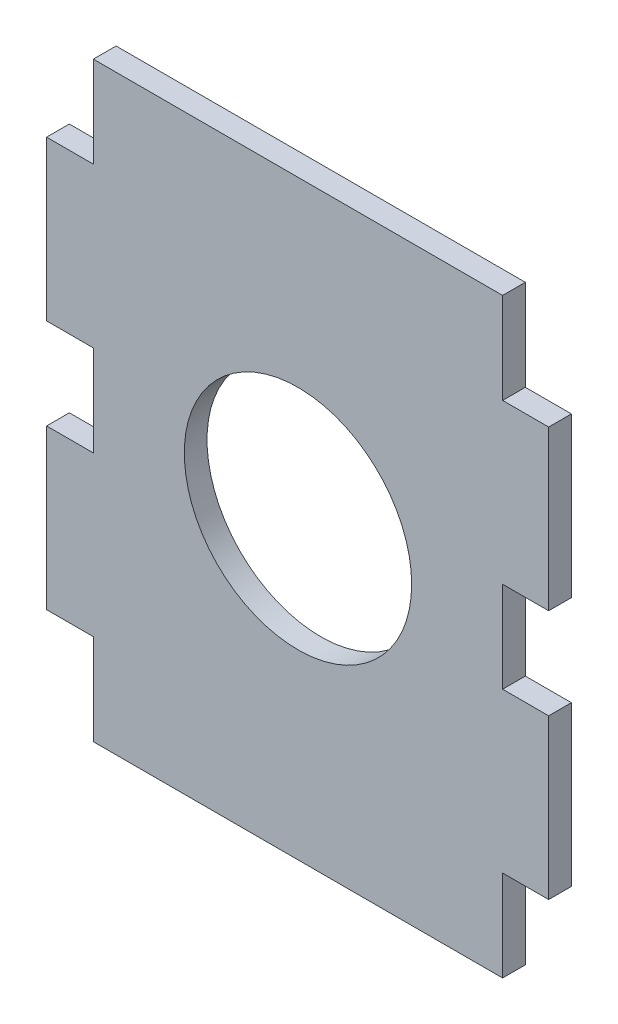
ISO-10303-21;
HEADER;
FILE_DESCRIPTION(('STEP AP214'),'2;1');
FILE_NAME('part.step','',(''),(''),'','','');
FILE_SCHEMA(('AUTOMOTIVE_DESIGN { 1 0 10303 214 1 1 1 1 }'));
ENDSEC;
DATA;
#1=APPLICATION_CONTEXT('core data for automotive mechanical design processes');
#2=APPLICATION_PROTOCOL_DEFINITION('international standard','automotive_design',2000,#1);
#3=PRODUCT_CONTEXT('',#1,'mechanical');
#4=PRODUCT('Part','Part','',(#3));
#5=PRODUCT_RELATED_PRODUCT_CATEGORY('part','',(#4));
#6=PRODUCT_DEFINITION_FORMATION('','',#4);
#7=PRODUCT_DEFINITION_CONTEXT('part definition',#1,'design');
#8=PRODUCT_DEFINITION('design','',#6,#7);
#9=PRODUCT_DEFINITION_SHAPE('','',#8);
#10=(LENGTH_UNIT() NAMED_UNIT(*) SI_UNIT(.MILLI.,.METRE.));
#11=(NAMED_UNIT(*) PLANE_ANGLE_UNIT() SI_UNIT($,.RADIAN.));
#12=(NAMED_UNIT(*) SI_UNIT($,.STERADIAN.) SOLID_ANGLE_UNIT());
#13=UNCERTAINTY_MEASURE_WITH_UNIT(LENGTH_MEASURE(1.E-05),#10,'distance_accuracy_value','');
#14=(GEOMETRIC_REPRESENTATION_CONTEXT(3) GLOBAL_UNCERTAINTY_ASSIGNED_CONTEXT((#13)) GLOBAL_UNIT_ASSIGNED_CONTEXT((#10,
#11,#12)) REPRESENTATION_CONTEXT('',''));
#15=CARTESIAN_POINT('',(0.,0.,0.));
#16=DIRECTION('',(0.,0.,1.));
#17=DIRECTION('',(1.,0.,0.));
#18=AXIS2_PLACEMENT_3D('',#15,#16,#17);
#19=CARTESIAN_POINT('',(-56.6737694950337,356.078918743844,-3.175));
#20=DIRECTION('',(-1.,0.,0.));
#21=DIRECTION('',(0.,0.,1.));
#22=AXIS2_PLACEMENT_3D('',#19,#20,#21);
#23=PLANE('',#22);
#24=DIRECTION('',(0.,-1.,0.));
#25=VECTOR('',#24,1.);
#26=CARTESIAN_POINT('',(-56.6737694950337,356.078918743844,0.));
#27=LINE('',#26,#25);
#28=CARTESIAN_POINT('',(-56.6737694950337,356.078918743844,0.));
#29=VERTEX_POINT('',#28);
#30=CARTESIAN_POINT('',(-56.6737694950337,343.378918743844,0.));
#31=VERTEX_POINT('',#30);
#32=EDGE_CURVE('E202',#29,#31,#27,.T.);
#33=ORIENTED_EDGE('',*,*,#32,.F.);
#34=DIRECTION('',(0.,0.,1.));
#35=VECTOR('',#34,1.);
#36=CARTESIAN_POINT('',(-56.6737694950337,356.078918743844,-3.175));
#37=LINE('',#36,#35);
#38=CARTESIAN_POINT('',(-56.6737694950337,356.078918743844,-3.175));
#39=VERTEX_POINT('',#38);
#40=EDGE_CURVE('E11',#39,#29,#37,.T.);
#41=ORIENTED_EDGE('',*,*,#40,.F.);
#42=DIRECTION('',(0.,-1.,0.));
#43=VECTOR('',#42,1.);
#44=CARTESIAN_POINT('',(-56.6737694950337,356.078918743844,-3.175));
#45=LINE('',#44,#43);
#46=CARTESIAN_POINT('',(-56.6737694950337,343.378918743844,-3.175));
#47=VERTEX_POINT('',#46);
#48=EDGE_CURVE('E259',#39,#47,#45,.T.);
#49=ORIENTED_EDGE('',*,*,#48,.T.);
#50=DIRECTION('',(0.,0.,1.));
#51=VECTOR('',#50,1.);
#52=CARTESIAN_POINT('',(-56.6737694950337,343.378918743844,-3.175));
#53=LINE('',#52,#51);
#54=EDGE_CURVE('E36',#47,#31,#53,.T.);
#55=ORIENTED_EDGE('',*,*,#54,.T.);
#56=EDGE_LOOP('',(#33,#41,#49,#55));
#57=FACE_BOUND('',#56,.T.);
#58=ADVANCED_FACE('F33',(#57),#23,.T.);
#59=CARTESIAN_POINT('',(-56.6737694950337,356.078918743844,-3.175));
#60=DIRECTION('',(0.,1.,0.));
#61=DIRECTION('',(0.,0.,1.));
#62=AXIS2_PLACEMENT_3D('',#59,#60,#61);
#63=PLANE('',#62);
#64=DIRECTION('',(-1.,0.,0.));
#65=VECTOR('',#64,1.);
#66=CARTESIAN_POINT('',(-56.6737694950337,356.078918743844,0.));
#67=LINE('',#66,#65);
#68=CARTESIAN_POINT('',(0.476230502818833,356.078918743844,0.));
#69=VERTEX_POINT('',#68);
#70=EDGE_CURVE('E257',#69,#29,#67,.T.);
#71=ORIENTED_EDGE('',*,*,#70,.F.);
#72=DIRECTION('',(0.,0.,1.));
#73=VECTOR('',#72,1.);
#74=CARTESIAN_POINT('',(0.476230502818833,356.078918743844,-3.175));
#75=LINE('',#74,#73);
#76=CARTESIAN_POINT('',(0.476230502818833,356.078918743844,-3.175));
#77=VERTEX_POINT('',#76);
#78=EDGE_CURVE('E42',#77,#69,#75,.T.);
#79=ORIENTED_EDGE('',*,*,#78,.F.);
#80=DIRECTION('',(-1.,0.,0.));
#81=VECTOR('',#80,1.);
#82=CARTESIAN_POINT('',(-56.6737694950337,356.078918743844,-3.175));
#83=LINE('',#82,#81);
#84=EDGE_CURVE('E192',#77,#39,#83,.T.);
#85=ORIENTED_EDGE('',*,*,#84,.T.);
#86=ORIENTED_EDGE('',*,*,#40,.T.);
#87=EDGE_LOOP('',(#71,#79,#85,#86));
#88=FACE_BOUND('',#87,.T.);
#89=ADVANCED_FACE('F295',(#88),#63,.T.);
#90=CARTESIAN_POINT('',(0.476230502818833,356.078918743844,-3.175));
#91=DIRECTION('',(1.,0.,0.));
#92=DIRECTION('',(0.,0.,-1.));
#93=AXIS2_PLACEMENT_3D('',#90,#91,#92);
#94=PLANE('',#93);
#95=DIRECTION('',(0.,1.,0.));
#96=VECTOR('',#95,1.);
#97=CARTESIAN_POINT('',(0.476230502818833,356.078918743844,0.));
#98=LINE('',#97,#96);
#99=CARTESIAN_POINT('',(0.476230502818833,343.378918743844,0.));
#100=VERTEX_POINT('',#99);
#101=EDGE_CURVE('E179',#100,#69,#98,.T.);
#102=ORIENTED_EDGE('',*,*,#101,.F.);
#103=DIRECTION('',(0.,0.,1.));
#104=VECTOR('',#103,1.);
#105=CARTESIAN_POINT('',(0.476230502818833,343.378918743844,-3.175));
#106=LINE('',#105,#104);
#107=CARTESIAN_POINT('',(0.476230502818833,343.378918743844,-3.175));
#108=VERTEX_POINT('',#107);
#109=EDGE_CURVE('E174',#108,#100,#106,.T.);
#110=ORIENTED_EDGE('',*,*,#109,.F.);
#111=DIRECTION('',(0.,1.,0.));
#112=VECTOR('',#111,1.);
#113=CARTESIAN_POINT('',(0.476230502818833,356.078918743844,-3.175));
#114=LINE('',#113,#112);
#115=EDGE_CURVE('E177',#108,#77,#114,.T.);
#116=ORIENTED_EDGE('',*,*,#115,.T.);
#117=ORIENTED_EDGE('',*,*,#78,.T.);
#118=EDGE_LOOP('',(#102,#110,#116,#117));
#119=FACE_BOUND('',#118,.T.);
#120=ADVANCED_FACE('F176',(#119),#94,.T.);
#121=CARTESIAN_POINT('',(6.90850310501321,343.378918743844,-3.175));
#122=DIRECTION('',(0.,1.,0.));
#123=DIRECTION('',(0.,0.,1.));
#124=AXIS2_PLACEMENT_3D('',#121,#122,#123);
#125=PLANE('',#124);
#126=DIRECTION('',(-1.,0.,0.));
#127=VECTOR('',#126,1.);
#128=CARTESIAN_POINT('',(6.90850310501321,343.378918743844,0.));
#129=LINE('',#128,#127);
#130=CARTESIAN_POINT('',(6.90850310501321,343.378918743844,0.));
#131=VERTEX_POINT('',#130);
#132=EDGE_CURVE('E254',#131,#100,#129,.T.);
#133=ORIENTED_EDGE('',*,*,#132,.F.);
#134=DIRECTION('',(0.,0.,1.));
#135=VECTOR('',#134,1.);
#136=CARTESIAN_POINT('',(6.90850310501321,343.378918743844,-3.175));
#137=LINE('',#136,#135);
#138=CARTESIAN_POINT('',(6.90850310501321,343.378918743844,-3.175));
#139=VERTEX_POINT('',#138);
#140=EDGE_CURVE('E184',#139,#131,#137,.T.);
#141=ORIENTED_EDGE('',*,*,#140,.F.);
#142=DIRECTION('',(-1.,0.,0.));
#143=VECTOR('',#142,1.);
#144=CARTESIAN_POINT('',(6.90850310501321,343.378918743844,-3.175));
#145=LINE('',#144,#143);
#146=EDGE_CURVE('E190',#139,#108,#145,.T.);
#147=ORIENTED_EDGE('',*,*,#146,.T.);
#148=ORIENTED_EDGE('',*,*,#109,.T.);
#149=EDGE_LOOP('',(#133,#141,#147,#148));
#150=FACE_BOUND('',#149,.T.);
#151=ADVANCED_FACE('F194',(#150),#125,.T.);
#152=CARTESIAN_POINT('',(6.90850310501321,343.378918743844,-3.175));
#153=DIRECTION('',(1.,0.,0.));
#154=DIRECTION('',(0.,1.,0.));
#155=AXIS2_PLACEMENT_3D('',#152,#153,#154);
#156=PLANE('',#155);
#157=DIRECTION('',(0.,1.,0.));
#158=VECTOR('',#157,1.);
#159=CARTESIAN_POINT('',(6.90850310501321,343.378918743844,0.));
#160=LINE('',#159,#158);
#161=CARTESIAN_POINT('',(6.90850310501322,321.153918743844,0.));
#162=VERTEX_POINT('',#161);
#163=EDGE_CURVE('E251',#162,#131,#160,.T.);
#164=ORIENTED_EDGE('',*,*,#163,.F.);
#165=DIRECTION('',(0.,0.,1.));
#166=VECTOR('',#165,1.);
#167=CARTESIAN_POINT('',(6.90850310501322,321.153918743844,-3.175));
#168=LINE('',#167,#166);
#169=CARTESIAN_POINT('',(6.90850310501322,321.153918743844,-3.175));
#170=VERTEX_POINT('',#169);
#171=EDGE_CURVE('E263',#170,#162,#168,.T.);
#172=ORIENTED_EDGE('',*,*,#171,.F.);
#173=DIRECTION('',(0.,1.,0.));
#174=VECTOR('',#173,1.);
#175=CARTESIAN_POINT('',(6.90850310501321,343.378918743844,-3.175));
#176=LINE('',#175,#174);
#177=EDGE_CURVE('E195',#170,#139,#176,.T.);
#178=ORIENTED_EDGE('',*,*,#177,.T.);
#179=ORIENTED_EDGE('',*,*,#140,.T.);
#180=EDGE_LOOP('',(#164,#172,#178,#179));
#181=FACE_BOUND('',#180,.T.);
#182=ADVANCED_FACE('F308',(#181),#156,.T.);
#183=CARTESIAN_POINT('',(6.90850310501322,321.153918743844,-3.175));
#184=DIRECTION('',(0.,-1.,0.));
#185=DIRECTION('',(0.,0.,-1.));
#186=AXIS2_PLACEMENT_3D('',#183,#184,#185);
#187=PLANE('',#186);
#188=DIRECTION('',(1.,0.,0.));
#189=VECTOR('',#188,1.);
#190=CARTESIAN_POINT('',(6.90850310501322,321.153918743844,0.));
#191=LINE('',#190,#189);
#192=CARTESIAN_POINT('',(0.476230502818833,321.153918743844,0.));
#193=VERTEX_POINT('',#192);
#194=EDGE_CURVE('E248',#193,#162,#191,.T.);
#195=ORIENTED_EDGE('',*,*,#194,.F.);
#196=DIRECTION('',(0.,0.,1.));
#197=VECTOR('',#196,1.);
#198=CARTESIAN_POINT('',(0.476230502818833,321.153918743844,-3.175));
#199=LINE('',#198,#197);
#200=CARTESIAN_POINT('',(0.476230502818833,321.153918743844,-3.175));
#201=VERTEX_POINT('',#200);
#202=EDGE_CURVE('E265',#201,#193,#199,.T.);
#203=ORIENTED_EDGE('',*,*,#202,.F.);
#204=DIRECTION('',(1.,0.,0.));
#205=VECTOR('',#204,1.);
#206=CARTESIAN_POINT('',(6.90850310501322,321.153918743844,-3.175));
#207=LINE('',#206,#205);
#208=EDGE_CURVE('E197',#201,#170,#207,.T.);
#209=ORIENTED_EDGE('',*,*,#208,.T.);
#210=ORIENTED_EDGE('',*,*,#171,.T.);
#211=EDGE_LOOP('',(#195,#203,#209,#210));
#212=FACE_BOUND('',#211,.T.);
#213=ADVANCED_FACE('F311',(#212),#187,.T.);
#214=CARTESIAN_POINT('',(0.476230502818833,308.453918743844,-3.175));
#215=DIRECTION('',(1.,0.,0.));
#216=DIRECTION('',(0.,0.,-1.));
#217=AXIS2_PLACEMENT_3D('',#214,#215,#216);
#218=PLANE('',#217);
#219=DIRECTION('',(0.,1.,0.));
#220=VECTOR('',#219,1.);
#221=CARTESIAN_POINT('',(0.476230502818833,308.453918743844,0.));
#222=LINE('',#221,#220);
#223=CARTESIAN_POINT('',(0.476230502818833,308.453918743844,0.));
#224=VERTEX_POINT('',#223);
#225=EDGE_CURVE('E245',#224,#193,#222,.T.);
#226=ORIENTED_EDGE('',*,*,#225,.F.);
#227=DIRECTION('',(0.,0.,1.));
#228=VECTOR('',#227,1.);
#229=CARTESIAN_POINT('',(0.476230502818833,308.453918743844,-3.175));
#230=LINE('',#229,#228);
#231=CARTESIAN_POINT('',(0.476230502818833,308.453918743844,-3.175));
#232=VERTEX_POINT('',#231);
#233=EDGE_CURVE('E267',#232,#224,#230,.T.);
#234=ORIENTED_EDGE('',*,*,#233,.F.);
#235=DIRECTION('',(0.,1.,0.));
#236=VECTOR('',#235,1.);
#237=CARTESIAN_POINT('',(0.476230502818833,308.453918743844,-3.175));
#238=LINE('',#237,#236);
#239=EDGE_CURVE('E430',#232,#201,#238,.T.);
#240=ORIENTED_EDGE('',*,*,#239,.T.);
#241=ORIENTED_EDGE('',*,*,#202,.T.);
#242=EDGE_LOOP('',(#226,#234,#240,#241));
#243=FACE_BOUND('',#242,.T.);
#244=ADVANCED_FACE('F315',(#243),#218,.T.);
#245=CARTESIAN_POINT('',(6.90850310501322,308.453918743844,-3.175));
#246=DIRECTION('',(0.,1.,0.));
#247=DIRECTION('',(0.,0.,1.));
#248=AXIS2_PLACEMENT_3D('',#245,#246,#247);
#249=PLANE('',#248);
#250=DIRECTION('',(-1.,0.,0.));
#251=VECTOR('',#250,1.);
#252=CARTESIAN_POINT('',(6.90850310501322,308.453918743844,0.));
#253=LINE('',#252,#251);
#254=CARTESIAN_POINT('',(6.90850310501322,308.453918743844,0.));
#255=VERTEX_POINT('',#254);
#256=EDGE_CURVE('E242',#255,#224,#253,.T.);
#257=ORIENTED_EDGE('',*,*,#256,.F.);
#258=DIRECTION('',(0.,0.,1.));
#259=VECTOR('',#258,1.);
#260=CARTESIAN_POINT('',(6.90850310501322,308.453918743844,-3.175));
#261=LINE('',#260,#259);
#262=CARTESIAN_POINT('',(6.90850310501322,308.453918743844,-3.175));
#263=VERTEX_POINT('',#262);
#264=EDGE_CURVE('E269',#263,#255,#261,.T.);
#265=ORIENTED_EDGE('',*,*,#264,.F.);
#266=DIRECTION('',(-1.,0.,0.));
#267=VECTOR('',#266,1.);
#268=CARTESIAN_POINT('',(6.90850310501322,308.453918743844,-3.175));
#269=LINE('',#268,#267);
#270=EDGE_CURVE('E427',#263,#232,#269,.T.);
#271=ORIENTED_EDGE('',*,*,#270,.T.);
#272=ORIENTED_EDGE('',*,*,#233,.T.);
#273=EDGE_LOOP('',(#257,#265,#271,#272));
#274=FACE_BOUND('',#273,.T.);
#275=ADVANCED_FACE('F319',(#274),#249,.T.);
#276=CARTESIAN_POINT('',(6.90850310501322,308.453918743844,-3.175));
#277=DIRECTION('',(1.,0.,0.));
#278=DIRECTION('',(0.,1.,0.));
#279=AXIS2_PLACEMENT_3D('',#276,#277,#278);
#280=PLANE('',#279);
#281=DIRECTION('',(0.,1.,0.));
#282=VECTOR('',#281,1.);
#283=CARTESIAN_POINT('',(6.90850310501322,308.453918743844,0.));
#284=LINE('',#283,#282);
#285=CARTESIAN_POINT('',(6.90850310501321,286.228918743844,0.));
#286=VERTEX_POINT('',#285);
#287=EDGE_CURVE('E239',#286,#255,#284,.T.);
#288=ORIENTED_EDGE('',*,*,#287,.F.);
#289=DIRECTION('',(0.,0.,1.));
#290=VECTOR('',#289,1.);
#291=CARTESIAN_POINT('',(6.90850310501321,286.228918743844,-3.175));
#292=LINE('',#291,#290);
#293=CARTESIAN_POINT('',(6.90850310501321,286.228918743844,-3.175));
#294=VERTEX_POINT('',#293);
#295=EDGE_CURVE('E271',#294,#286,#292,.T.);
#296=ORIENTED_EDGE('',*,*,#295,.F.);
#297=DIRECTION('',(0.,1.,0.));
#298=VECTOR('',#297,1.);
#299=CARTESIAN_POINT('',(6.90850310501322,308.453918743844,-3.175));
#300=LINE('',#299,#298);
#301=EDGE_CURVE('E424',#294,#263,#300,.T.);
#302=ORIENTED_EDGE('',*,*,#301,.T.);
#303=ORIENTED_EDGE('',*,*,#264,.T.);
#304=EDGE_LOOP('',(#288,#296,#302,#303));
#305=FACE_BOUND('',#304,.T.);
#306=ADVANCED_FACE('F323',(#305),#280,.T.);
#307=CARTESIAN_POINT('',(6.90850310501321,286.228918743844,-3.175));
#308=DIRECTION('',(0.,-1.,0.));
#309=DIRECTION('',(0.,0.,-1.));
#310=AXIS2_PLACEMENT_3D('',#307,#308,#309);
#311=PLANE('',#310);
#312=DIRECTION('',(1.,0.,0.));
#313=VECTOR('',#312,1.);
#314=CARTESIAN_POINT('',(6.90850310501321,286.228918743844,0.));
#315=LINE('',#314,#313);
#316=CARTESIAN_POINT('',(0.476230502818833,286.228918743844,0.));
#317=VERTEX_POINT('',#316);
#318=EDGE_CURVE('E236',#317,#286,#315,.T.);
#319=ORIENTED_EDGE('',*,*,#318,.F.);
#320=DIRECTION('',(0.,0.,1.));
#321=VECTOR('',#320,1.);
#322=CARTESIAN_POINT('',(0.476230502818833,286.228918743844,-3.175));
#323=LINE('',#322,#321);
#324=CARTESIAN_POINT('',(0.476230502818833,286.228918743844,-3.175));
#325=VERTEX_POINT('',#324);
#326=EDGE_CURVE('E273',#325,#317,#323,.T.);
#327=ORIENTED_EDGE('',*,*,#326,.F.);
#328=DIRECTION('',(1.,0.,0.));
#329=VECTOR('',#328,1.);
#330=CARTESIAN_POINT('',(6.90850310501321,286.228918743844,-3.175));
#331=LINE('',#330,#329);
#332=EDGE_CURVE('E421',#325,#294,#331,.T.);
#333=ORIENTED_EDGE('',*,*,#332,.T.);
#334=ORIENTED_EDGE('',*,*,#295,.T.);
#335=EDGE_LOOP('',(#319,#327,#333,#334));
#336=FACE_BOUND('',#335,.T.);
#337=ADVANCED_FACE('F327',(#336),#311,.T.);
#338=CARTESIAN_POINT('',(0.476230502818833,273.528918743844,-3.175));
#339=DIRECTION('',(1.,0.,0.));
#340=DIRECTION('',(0.,0.,-1.));
#341=AXIS2_PLACEMENT_3D('',#338,#339,#340);
#342=PLANE('',#341);
#343=DIRECTION('',(0.,1.,0.));
#344=VECTOR('',#343,1.);
#345=CARTESIAN_POINT('',(0.476230502818833,273.528918743844,0.));
#346=LINE('',#345,#344);
#347=CARTESIAN_POINT('',(0.476230502818833,273.528918743844,0.));
#348=VERTEX_POINT('',#347);
#349=EDGE_CURVE('E233',#348,#317,#346,.T.);
#350=ORIENTED_EDGE('',*,*,#349,.F.);
#351=DIRECTION('',(0.,0.,1.));
#352=VECTOR('',#351,1.);
#353=CARTESIAN_POINT('',(0.476230502818833,273.528918743844,-3.175));
#354=LINE('',#353,#352);
#355=CARTESIAN_POINT('',(0.476230502818833,273.528918743844,-3.175));
#356=VERTEX_POINT('',#355);
#357=EDGE_CURVE('E275',#356,#348,#354,.T.);
#358=ORIENTED_EDGE('',*,*,#357,.F.);
#359=DIRECTION('',(0.,1.,0.));
#360=VECTOR('',#359,1.);
#361=CARTESIAN_POINT('',(0.476230502818833,273.528918743844,-3.175));
#362=LINE('',#361,#360);
#363=EDGE_CURVE('E418',#356,#325,#362,.T.);
#364=ORIENTED_EDGE('',*,*,#363,.T.);
#365=ORIENTED_EDGE('',*,*,#326,.T.);
#366=EDGE_LOOP('',(#350,#358,#364,#365));
#367=FACE_BOUND('',#366,.T.);
#368=ADVANCED_FACE('F331',(#367),#342,.T.);
#369=CARTESIAN_POINT('',(-56.6737694950337,273.528918743844,-3.175));
#370=DIRECTION('',(0.,-1.,0.));
#371=DIRECTION('',(0.,0.,-1.));
#372=AXIS2_PLACEMENT_3D('',#369,#370,#371);
#373=PLANE('',#372);
#374=DIRECTION('',(1.,0.,0.));
#375=VECTOR('',#374,1.);
#376=CARTESIAN_POINT('',(-56.6737694950337,273.528918743844,0.));
#377=LINE('',#376,#375);
#378=CARTESIAN_POINT('',(-56.6737694950337,273.528918743844,0.));
#379=VERTEX_POINT('',#378);
#380=EDGE_CURVE('E230',#379,#348,#377,.T.);
#381=ORIENTED_EDGE('',*,*,#380,.F.);
#382=DIRECTION('',(0.,0.,1.));
#383=VECTOR('',#382,1.);
#384=CARTESIAN_POINT('',(-56.6737694950337,273.528918743844,-3.175));
#385=LINE('',#384,#383);
#386=CARTESIAN_POINT('',(-56.6737694950337,273.528918743844,-3.175));
#387=VERTEX_POINT('',#386);
#388=EDGE_CURVE('E277',#387,#379,#385,.T.);
#389=ORIENTED_EDGE('',*,*,#388,.F.);
#390=DIRECTION('',(1.,0.,0.));
#391=VECTOR('',#390,1.);
#392=CARTESIAN_POINT('',(-56.6737694950337,273.528918743844,-3.175));
#393=LINE('',#392,#391);
#394=EDGE_CURVE('E415',#387,#356,#393,.T.);
#395=ORIENTED_EDGE('',*,*,#394,.T.);
#396=ORIENTED_EDGE('',*,*,#357,.T.);
#397=EDGE_LOOP('',(#381,#389,#395,#396));
#398=FACE_BOUND('',#397,.T.);
#399=ADVANCED_FACE('F335',(#398),#373,.T.);
#400=CARTESIAN_POINT('',(-56.6737694950337,273.528918743844,-3.175));
#401=DIRECTION('',(-1.,0.,0.));
#402=DIRECTION('',(0.,0.,1.));
#403=AXIS2_PLACEMENT_3D('',#400,#401,#402);
#404=PLANE('',#403);
#405=DIRECTION('',(0.,-1.,0.));
#406=VECTOR('',#405,1.);
#407=CARTESIAN_POINT('',(-56.6737694950337,273.528918743844,0.));
#408=LINE('',#407,#406);
#409=CARTESIAN_POINT('',(-56.6737694950337,286.228918743844,0.));
#410=VERTEX_POINT('',#409);
#411=EDGE_CURVE('E227',#410,#379,#408,.T.);
#412=ORIENTED_EDGE('',*,*,#411,.F.);
#413=DIRECTION('',(0.,0.,1.));
#414=VECTOR('',#413,1.);
#415=CARTESIAN_POINT('',(-56.6737694950337,286.228918743844,-3.175));
#416=LINE('',#415,#414);
#417=CARTESIAN_POINT('',(-56.6737694950337,286.228918743844,-3.175));
#418=VERTEX_POINT('',#417);
#419=EDGE_CURVE('E279',#418,#410,#416,.T.);
#420=ORIENTED_EDGE('',*,*,#419,.F.);
#421=DIRECTION('',(0.,-1.,0.));
#422=VECTOR('',#421,1.);
#423=CARTESIAN_POINT('',(-56.6737694950337,273.528918743844,-3.175));
#424=LINE('',#423,#422);
#425=EDGE_CURVE('E412',#418,#387,#424,.T.);
#426=ORIENTED_EDGE('',*,*,#425,.T.);
#427=ORIENTED_EDGE('',*,*,#388,.T.);
#428=EDGE_LOOP('',(#412,#420,#426,#427));
#429=FACE_BOUND('',#428,.T.);
#430=ADVANCED_FACE('F339',(#429),#404,.T.);
#431=CARTESIAN_POINT('',(-63.2031606583276,286.228918743844,-3.175));
#432=DIRECTION('',(0.,-1.,0.));
#433=DIRECTION('',(0.,0.,-1.));
#434=AXIS2_PLACEMENT_3D('',#431,#432,#433);
#435=PLANE('',#434);
#436=DIRECTION('',(1.,0.,0.));
#437=VECTOR('',#436,1.);
#438=CARTESIAN_POINT('',(-63.2031606583276,286.228918743844,0.));
#439=LINE('',#438,#437);
#440=CARTESIAN_POINT('',(-63.2031606583276,286.228918743844,0.));
#441=VERTEX_POINT('',#440);
#442=EDGE_CURVE('E224',#441,#410,#439,.T.);
#443=ORIENTED_EDGE('',*,*,#442,.F.);
#444=DIRECTION('',(0.,0.,1.));
#445=VECTOR('',#444,1.);
#446=CARTESIAN_POINT('',(-63.2031606583276,286.228918743844,-3.175));
#447=LINE('',#446,#445);
#448=CARTESIAN_POINT('',(-63.2031606583276,286.228918743844,-3.175));
#449=VERTEX_POINT('',#448);
#450=EDGE_CURVE('E281',#449,#441,#447,.T.);
#451=ORIENTED_EDGE('',*,*,#450,.F.);
#452=DIRECTION('',(1.,0.,0.));
#453=VECTOR('',#452,1.);
#454=CARTESIAN_POINT('',(-63.2031606583276,286.228918743844,-3.175));
#455=LINE('',#454,#453);
#456=EDGE_CURVE('E409',#449,#418,#455,.T.);
#457=ORIENTED_EDGE('',*,*,#456,.T.);
#458=ORIENTED_EDGE('',*,*,#419,.T.);
#459=EDGE_LOOP('',(#443,#451,#457,#458));
#460=FACE_BOUND('',#459,.T.);
#461=ADVANCED_FACE('F343',(#460),#435,.T.);
#462=CARTESIAN_POINT('',(-63.2031606583276,308.453918743844,-3.175));
#463=DIRECTION('',(-1.,0.,0.));
#464=DIRECTION('',(0.,-1.,0.));
#465=AXIS2_PLACEMENT_3D('',#462,#463,#464);
#466=PLANE('',#465);
#467=DIRECTION('',(0.,-1.,0.));
#468=VECTOR('',#467,1.);
#469=CARTESIAN_POINT('',(-63.2031606583276,308.453918743844,0.));
#470=LINE('',#469,#468);
#471=CARTESIAN_POINT('',(-63.2031606583276,308.453918743844,0.));
#472=VERTEX_POINT('',#471);
#473=EDGE_CURVE('E221',#472,#441,#470,.T.);
#474=ORIENTED_EDGE('',*,*,#473,.F.);
#475=DIRECTION('',(0.,0.,1.));
#476=VECTOR('',#475,1.);
#477=CARTESIAN_POINT('',(-63.2031606583276,308.453918743844,-3.175));
#478=LINE('',#477,#476);
#479=CARTESIAN_POINT('',(-63.2031606583276,308.453918743844,-3.175));
#480=VERTEX_POINT('',#479);
#481=EDGE_CURVE('E283',#480,#472,#478,.T.);
#482=ORIENTED_EDGE('',*,*,#481,.F.);
#483=DIRECTION('',(0.,-1.,0.));
#484=VECTOR('',#483,1.);
#485=CARTESIAN_POINT('',(-63.2031606583276,308.453918743844,-3.175));
#486=LINE('',#485,#484);
#487=EDGE_CURVE('E406',#480,#449,#486,.T.);
#488=ORIENTED_EDGE('',*,*,#487,.T.);
#489=ORIENTED_EDGE('',*,*,#450,.T.);
#490=EDGE_LOOP('',(#474,#482,#488,#489));
#491=FACE_BOUND('',#490,.T.);
#492=ADVANCED_FACE('F347',(#491),#466,.T.);
#493=CARTESIAN_POINT('',(-63.2031606583276,308.453918743844,-3.175));
#494=DIRECTION('',(0.,1.,0.));
#495=DIRECTION('',(0.,0.,1.));
#496=AXIS2_PLACEMENT_3D('',#493,#494,#495);
#497=PLANE('',#496);
#498=DIRECTION('',(-1.,0.,0.));
#499=VECTOR('',#498,1.);
#500=CARTESIAN_POINT('',(-63.2031606583276,308.453918743844,0.));
#501=LINE('',#500,#499);
#502=CARTESIAN_POINT('',(-56.6737694950337,308.453918743844,0.));
#503=VERTEX_POINT('',#502);
#504=EDGE_CURVE('E218',#503,#472,#501,.T.);
#505=ORIENTED_EDGE('',*,*,#504,.F.);
#506=DIRECTION('',(0.,0.,1.));
#507=VECTOR('',#506,1.);
#508=CARTESIAN_POINT('',(-56.6737694950337,308.453918743844,-3.175));
#509=LINE('',#508,#507);
#510=CARTESIAN_POINT('',(-56.6737694950337,308.453918743844,-3.175));
#511=VERTEX_POINT('',#510);
#512=EDGE_CURVE('E285',#511,#503,#509,.T.);
#513=ORIENTED_EDGE('',*,*,#512,.F.);
#514=DIRECTION('',(-1.,0.,0.));
#515=VECTOR('',#514,1.);
#516=CARTESIAN_POINT('',(-63.2031606583276,308.453918743844,-3.175));
#517=LINE('',#516,#515);
#518=EDGE_CURVE('E403',#511,#480,#517,.T.);
#519=ORIENTED_EDGE('',*,*,#518,.T.);
#520=ORIENTED_EDGE('',*,*,#481,.T.);
#521=EDGE_LOOP('',(#505,#513,#519,#520));
#522=FACE_BOUND('',#521,.T.);
#523=ADVANCED_FACE('F351',(#522),#497,.T.);
#524=CARTESIAN_POINT('',(-56.6737694950337,308.453918743844,-3.175));
#525=DIRECTION('',(-1.,0.,0.));
#526=DIRECTION('',(0.,0.,1.));
#527=AXIS2_PLACEMENT_3D('',#524,#525,#526);
#528=PLANE('',#527);
#529=DIRECTION('',(0.,-1.,0.));
#530=VECTOR('',#529,1.);
#531=CARTESIAN_POINT('',(-56.6737694950337,308.453918743844,0.));
#532=LINE('',#531,#530);
#533=CARTESIAN_POINT('',(-56.6737694950337,321.153918743844,0.));
#534=VERTEX_POINT('',#533);
#535=EDGE_CURVE('E215',#534,#503,#532,.T.);
#536=ORIENTED_EDGE('',*,*,#535,.F.);
#537=DIRECTION('',(0.,0.,1.));
#538=VECTOR('',#537,1.);
#539=CARTESIAN_POINT('',(-56.6737694950337,321.153918743844,-3.175));
#540=LINE('',#539,#538);
#541=CARTESIAN_POINT('',(-56.6737694950337,321.153918743844,-3.175));
#542=VERTEX_POINT('',#541);
#543=EDGE_CURVE('E287',#542,#534,#540,.T.);
#544=ORIENTED_EDGE('',*,*,#543,.F.);
#545=DIRECTION('',(0.,-1.,0.));
#546=VECTOR('',#545,1.);
#547=CARTESIAN_POINT('',(-56.6737694950337,308.453918743844,-3.175));
#548=LINE('',#547,#546);
#549=EDGE_CURVE('E400',#542,#511,#548,.T.);
#550=ORIENTED_EDGE('',*,*,#549,.T.);
#551=ORIENTED_EDGE('',*,*,#512,.T.);
#552=EDGE_LOOP('',(#536,#544,#550,#551));
#553=FACE_BOUND('',#552,.T.);
#554=ADVANCED_FACE('F355',(#553),#528,.T.);
#555=CARTESIAN_POINT('',(-63.2031606583276,321.153918743844,-3.175));
#556=DIRECTION('',(0.,-1.,0.));
#557=DIRECTION('',(0.,0.,-1.));
#558=AXIS2_PLACEMENT_3D('',#555,#556,#557);
#559=PLANE('',#558);
#560=DIRECTION('',(1.,0.,0.));
#561=VECTOR('',#560,1.);
#562=CARTESIAN_POINT('',(-63.2031606583276,321.153918743844,0.));
#563=LINE('',#562,#561);
#564=CARTESIAN_POINT('',(-63.2031606583276,321.153918743844,0.));
#565=VERTEX_POINT('',#564);
#566=EDGE_CURVE('E212',#565,#534,#563,.T.);
#567=ORIENTED_EDGE('',*,*,#566,.F.);
#568=DIRECTION('',(0.,0.,1.));
#569=VECTOR('',#568,1.);
#570=CARTESIAN_POINT('',(-63.2031606583276,321.153918743844,-3.175));
#571=LINE('',#570,#569);
#572=CARTESIAN_POINT('',(-63.2031606583276,321.153918743844,-3.175));
#573=VERTEX_POINT('',#572);
#574=EDGE_CURVE('E289',#573,#565,#571,.T.);
#575=ORIENTED_EDGE('',*,*,#574,.F.);
#576=DIRECTION('',(1.,0.,0.));
#577=VECTOR('',#576,1.);
#578=CARTESIAN_POINT('',(-63.2031606583276,321.153918743844,-3.175));
#579=LINE('',#578,#577);
#580=EDGE_CURVE('E397',#573,#542,#579,.T.);
#581=ORIENTED_EDGE('',*,*,#580,.T.);
#582=ORIENTED_EDGE('',*,*,#543,.T.);
#583=EDGE_LOOP('',(#567,#575,#581,#582));
#584=FACE_BOUND('',#583,.T.);
#585=ADVANCED_FACE('F359',(#584),#559,.T.);
#586=CARTESIAN_POINT('',(-63.2031606583276,343.378918743844,-3.175));
#587=DIRECTION('',(-1.,0.,0.));
#588=DIRECTION('',(0.,0.,1.));
#589=AXIS2_PLACEMENT_3D('',#586,#587,#588);
#590=PLANE('',#589);
#591=DIRECTION('',(0.,-1.,0.));
#592=VECTOR('',#591,1.);
#593=CARTESIAN_POINT('',(-63.2031606583276,343.378918743844,0.));
#594=LINE('',#593,#592);
#595=CARTESIAN_POINT('',(-63.2031606583276,343.378918743844,0.));
#596=VERTEX_POINT('',#595);
#597=EDGE_CURVE('E209',#596,#565,#594,.T.);
#598=ORIENTED_EDGE('',*,*,#597,.F.);
#599=DIRECTION('',(0.,0.,1.));
#600=VECTOR('',#599,1.);
#601=CARTESIAN_POINT('',(-63.2031606583276,343.378918743844,-3.175));
#602=LINE('',#601,#600);
#603=CARTESIAN_POINT('',(-63.2031606583276,343.378918743844,-3.175));
#604=VERTEX_POINT('',#603);
#605=EDGE_CURVE('E290',#604,#596,#602,.T.);
#606=ORIENTED_EDGE('',*,*,#605,.F.);
#607=DIRECTION('',(0.,-1.,0.));
#608=VECTOR('',#607,1.);
#609=CARTESIAN_POINT('',(-63.2031606583276,343.378918743844,-3.175));
#610=LINE('',#609,#608);
#611=EDGE_CURVE('E394',#604,#573,#610,.T.);
#612=ORIENTED_EDGE('',*,*,#611,.T.);
#613=ORIENTED_EDGE('',*,*,#574,.T.);
#614=EDGE_LOOP('',(#598,#606,#612,#613));
#615=FACE_BOUND('',#614,.T.);
#616=ADVANCED_FACE('F363',(#615),#590,.T.);
#617=CARTESIAN_POINT('',(-63.2031606583276,343.378918743844,-3.175));
#618=DIRECTION('',(0.,1.,0.));
#619=DIRECTION('',(0.,0.,1.));
#620=AXIS2_PLACEMENT_3D('',#617,#618,#619);
#621=PLANE('',#620);
#622=DIRECTION('',(-1.,0.,0.));
#623=VECTOR('',#622,1.);
#624=CARTESIAN_POINT('',(-63.2031606583276,343.378918743844,0.));
#625=LINE('',#624,#623);
#626=EDGE_CURVE('E205',#31,#596,#625,.T.);
#627=ORIENTED_EDGE('',*,*,#626,.F.);
#628=ORIENTED_EDGE('',*,*,#54,.F.);
#629=DIRECTION('',(-1.,0.,0.));
#630=VECTOR('',#629,1.);
#631=CARTESIAN_POINT('',(-63.2031606583276,343.378918743844,-3.175));
#632=LINE('',#631,#630);
#633=EDGE_CURVE('E392',#47,#604,#632,.T.);
#634=ORIENTED_EDGE('',*,*,#633,.T.);
#635=ORIENTED_EDGE('',*,*,#605,.T.);
#636=EDGE_LOOP('',(#627,#628,#634,#635));
#637=FACE_BOUND('',#636,.T.);
#638=ADVANCED_FACE('F292',(#637),#621,.T.);
#639=CARTESIAN_POINT('',(0.,0.,-3.175));
#640=DIRECTION('',(0.,0.,1.));
#641=DIRECTION('',(1.,0.,0.));
#642=AXIS2_PLACEMENT_3D('',#639,#640,#641);
#643=PLANE('',#642);
#644=CARTESIAN_POINT('',(-28.0987694971812,314.803918743844,-3.175));
#645=DIRECTION('',(0.,0.,1.));
#646=DIRECTION('',(1.,0.,0.));
#647=AXIS2_PLACEMENT_3D('',#644,#645,#646);
#648=CIRCLE('',#647,15.875);
#649=CARTESIAN_POINT('',(-12.2237694971812,314.803918743844,-3.175));
#650=VERTEX_POINT('',#649);
#651=EDGE_CURVE('E206',#650,#650,#648,.T.);
#652=ORIENTED_EDGE('',*,*,#651,.T.);
#653=EDGE_LOOP('',(#652));
#654=FACE_BOUND('',#653,.T.);
#655=ORIENTED_EDGE('',*,*,#48,.F.);
#656=ORIENTED_EDGE('',*,*,#84,.F.);
#657=ORIENTED_EDGE('',*,*,#115,.F.);
#658=ORIENTED_EDGE('',*,*,#146,.F.);
#659=ORIENTED_EDGE('',*,*,#177,.F.);
#660=ORIENTED_EDGE('',*,*,#208,.F.);
#661=ORIENTED_EDGE('',*,*,#239,.F.);
#662=ORIENTED_EDGE('',*,*,#270,.F.);
#663=ORIENTED_EDGE('',*,*,#301,.F.);
#664=ORIENTED_EDGE('',*,*,#332,.F.);
#665=ORIENTED_EDGE('',*,*,#363,.F.);
#666=ORIENTED_EDGE('',*,*,#394,.F.);
#667=ORIENTED_EDGE('',*,*,#425,.F.);
#668=ORIENTED_EDGE('',*,*,#456,.F.);
#669=ORIENTED_EDGE('',*,*,#487,.F.);
#670=ORIENTED_EDGE('',*,*,#518,.F.);
#671=ORIENTED_EDGE('',*,*,#549,.F.);
#672=ORIENTED_EDGE('',*,*,#580,.F.);
#673=ORIENTED_EDGE('',*,*,#611,.F.);
#674=ORIENTED_EDGE('',*,*,#633,.F.);
#675=EDGE_LOOP('',(#655,#656,#657,#658,#659,#660,#661,#662,#663,#664,#665,#666,#667,#668,#669,
#670,#671,#672,#673,#674));
#676=FACE_BOUND('',#675,.T.);
#677=ADVANCED_FACE('F188',(#654,#676),#643,.F.);
#678=CARTESIAN_POINT('',(0.,0.,0.));
#679=DIRECTION('',(0.,0.,1.));
#680=DIRECTION('',(1.,0.,0.));
#681=AXIS2_PLACEMENT_3D('',#678,#679,#680);
#682=PLANE('',#681);
#683=CARTESIAN_POINT('',(-28.0987694971812,314.803918743844,0.));
#684=DIRECTION('',(0.,0.,1.));
#685=DIRECTION('',(1.,0.,0.));
#686=AXIS2_PLACEMENT_3D('',#683,#684,#685);
#687=CIRCLE('',#686,15.875);
#688=CARTESIAN_POINT('',(-12.2237694971812,314.803918743844,0.));
#689=VERTEX_POINT('',#688);
#690=EDGE_CURVE('E387',#689,#689,#687,.T.);
#691=ORIENTED_EDGE('',*,*,#690,.F.);
#692=EDGE_LOOP('',(#691));
#693=FACE_BOUND('',#692,.T.);
#694=ORIENTED_EDGE('',*,*,#32,.T.);
#695=ORIENTED_EDGE('',*,*,#626,.T.);
#696=ORIENTED_EDGE('',*,*,#597,.T.);
#697=ORIENTED_EDGE('',*,*,#566,.T.);
#698=ORIENTED_EDGE('',*,*,#535,.T.);
#699=ORIENTED_EDGE('',*,*,#504,.T.);
#700=ORIENTED_EDGE('',*,*,#473,.T.);
#701=ORIENTED_EDGE('',*,*,#442,.T.);
#702=ORIENTED_EDGE('',*,*,#411,.T.);
#703=ORIENTED_EDGE('',*,*,#380,.T.);
#704=ORIENTED_EDGE('',*,*,#349,.T.);
#705=ORIENTED_EDGE('',*,*,#318,.T.);
#706=ORIENTED_EDGE('',*,*,#287,.T.);
#707=ORIENTED_EDGE('',*,*,#256,.T.);
#708=ORIENTED_EDGE('',*,*,#225,.T.);
#709=ORIENTED_EDGE('',*,*,#194,.T.);
#710=ORIENTED_EDGE('',*,*,#163,.T.);
#711=ORIENTED_EDGE('',*,*,#132,.T.);
#712=ORIENTED_EDGE('',*,*,#101,.T.);
#713=ORIENTED_EDGE('',*,*,#70,.T.);
#714=EDGE_LOOP('',(#694,#695,#696,#697,#698,#699,#700,#701,#702,#703,#704,#705,#706,#707,#708,
#709,#710,#711,#712,#713));
#715=FACE_BOUND('',#714,.T.);
#716=ADVANCED_FACE('F294',(#693,#715),#682,.T.);
#717=CARTESIAN_POINT('',(-28.0987694971812,314.803918743844,-3.175));
#718=DIRECTION('',(0.,0.,1.));
#719=DIRECTION('',(1.,0.,0.));
#720=AXIS2_PLACEMENT_3D('',#717,#718,#719);
#721=CYLINDRICAL_SURFACE('',#720,15.875);
#722=ORIENTED_EDGE('',*,*,#651,.F.);
#723=EDGE_LOOP('',(#722));
#724=FACE_BOUND('',#723,.T.);
#725=ORIENTED_EDGE('',*,*,#690,.T.);
#726=EDGE_LOOP('',(#725));
#727=FACE_BOUND('',#726,.T.);
#728=ADVANCED_FACE('F375',(#724,#727),#721,.F.);
#729=CLOSED_SHELL('',(#58,#89,#120,#151,#182,#213,#244,#275,#306,#337,#368,#399,#430,#461,#492,
#523,#554,#585,#616,#638,#677,#716,#728));
#730=MANIFOLD_SOLID_BREP('B2',#729);
#731=ADVANCED_BREP_SHAPE_REPRESENTATION('',(#18,#730),#14);
#732=SHAPE_DEFINITION_REPRESENTATION(#9,#731);
ENDSEC;
END-ISO-10303-21;
